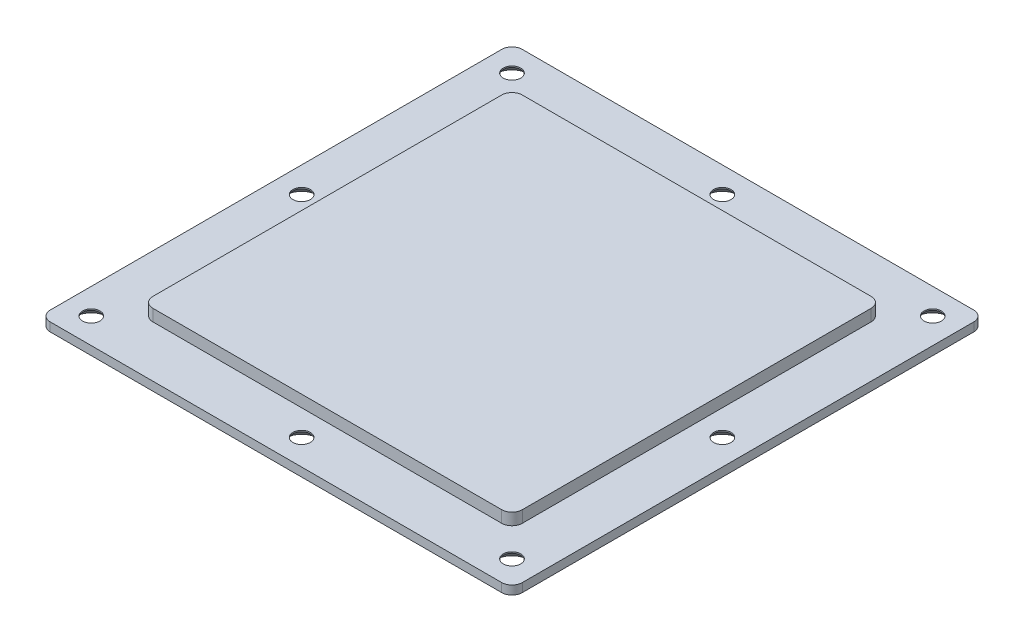
ISO-10303-21;
HEADER;
FILE_DESCRIPTION(('STEP AP214'),'2;1');
FILE_NAME('part.step','',(''),(''),'','','');
FILE_SCHEMA(('AUTOMOTIVE_DESIGN { 1 0 10303 214 1 1 1 1 }'));
ENDSEC;
DATA;
#1=APPLICATION_CONTEXT('core data for automotive mechanical design processes');
#2=APPLICATION_PROTOCOL_DEFINITION('international standard','automotive_design',2000,#1);
#3=PRODUCT_CONTEXT('',#1,'mechanical');
#4=PRODUCT('Part','Part','',(#3));
#5=PRODUCT_RELATED_PRODUCT_CATEGORY('part','',(#4));
#6=PRODUCT_DEFINITION_FORMATION('','',#4);
#7=PRODUCT_DEFINITION_CONTEXT('part definition',#1,'design');
#8=PRODUCT_DEFINITION('design','',#6,#7);
#9=PRODUCT_DEFINITION_SHAPE('','',#8);
#10=(LENGTH_UNIT() NAMED_UNIT(*) SI_UNIT(.MILLI.,.METRE.));
#11=(NAMED_UNIT(*) PLANE_ANGLE_UNIT() SI_UNIT($,.RADIAN.));
#12=(NAMED_UNIT(*) SI_UNIT($,.STERADIAN.) SOLID_ANGLE_UNIT());
#13=UNCERTAINTY_MEASURE_WITH_UNIT(LENGTH_MEASURE(1.E-05),#10,'distance_accuracy_value','');
#14=(GEOMETRIC_REPRESENTATION_CONTEXT(3) GLOBAL_UNCERTAINTY_ASSIGNED_CONTEXT((#13)) GLOBAL_UNIT_ASSIGNED_CONTEXT((#10,
#11,#12)) REPRESENTATION_CONTEXT('',''));
#15=CARTESIAN_POINT('',(0.,0.,0.));
#16=DIRECTION('',(0.,0.,1.));
#17=DIRECTION('',(1.,0.,0.));
#18=AXIS2_PLACEMENT_3D('',#15,#16,#17);
#19=CARTESIAN_POINT('',(0.,0.85,0.));
#20=DIRECTION('',(0.,-1.,0.));
#21=DIRECTION('',(0.,0.,-1.));
#22=AXIS2_PLACEMENT_3D('',#19,#20,#21);
#23=PLANE('',#22);
#24=CARTESIAN_POINT('',(-41.,0.85,41.));
#25=DIRECTION('',(0.,-1.,0.));
#26=DIRECTION('',(0.,0.,-1.));
#27=AXIS2_PLACEMENT_3D('',#24,#25,#26);
#28=CIRCLE('',#27,1.7);
#29=CARTESIAN_POINT('',(-41.,0.85,39.3));
#30=VERTEX_POINT('',#29);
#31=EDGE_CURVE('E225',#30,#30,#28,.T.);
#32=ORIENTED_EDGE('',*,*,#31,.T.);
#33=EDGE_LOOP('',(#32));
#34=FACE_BOUND('',#33,.T.);
#35=CARTESIAN_POINT('',(0.,0.85,41.));
#36=DIRECTION('',(0.,-1.,0.));
#37=DIRECTION('',(0.,0.,-1.));
#38=AXIS2_PLACEMENT_3D('',#35,#36,#37);
#39=CIRCLE('',#38,1.7);
#40=CARTESIAN_POINT('',(0.,0.85,39.3));
#41=VERTEX_POINT('',#40);
#42=EDGE_CURVE('E220',#41,#41,#39,.T.);
#43=ORIENTED_EDGE('',*,*,#42,.T.);
#44=EDGE_LOOP('',(#43));
#45=FACE_BOUND('',#44,.T.);
#46=CARTESIAN_POINT('',(41.,0.85,41.));
#47=DIRECTION('',(0.,-1.,0.));
#48=DIRECTION('',(0.,0.,-1.));
#49=AXIS2_PLACEMENT_3D('',#46,#47,#48);
#50=CIRCLE('',#49,1.7);
#51=CARTESIAN_POINT('',(41.,0.85,39.3));
#52=VERTEX_POINT('',#51);
#53=EDGE_CURVE('E215',#52,#52,#50,.T.);
#54=ORIENTED_EDGE('',*,*,#53,.T.);
#55=EDGE_LOOP('',(#54));
#56=FACE_BOUND('',#55,.T.);
#57=CARTESIAN_POINT('',(41.,0.85,0.));
#58=DIRECTION('',(0.,-1.,0.));
#59=DIRECTION('',(0.,0.,-1.));
#60=AXIS2_PLACEMENT_3D('',#57,#58,#59);
#61=CIRCLE('',#60,1.7);
#62=CARTESIAN_POINT('',(41.,0.85,-1.7));
#63=VERTEX_POINT('',#62);
#64=EDGE_CURVE('E210',#63,#63,#61,.T.);
#65=ORIENTED_EDGE('',*,*,#64,.T.);
#66=EDGE_LOOP('',(#65));
#67=FACE_BOUND('',#66,.T.);
#68=CARTESIAN_POINT('',(41.,0.85,-41.));
#69=DIRECTION('',(0.,-1.,0.));
#70=DIRECTION('',(0.,0.,-1.));
#71=AXIS2_PLACEMENT_3D('',#68,#69,#70);
#72=CIRCLE('',#71,1.7);
#73=CARTESIAN_POINT('',(41.,0.85,-42.7));
#74=VERTEX_POINT('',#73);
#75=EDGE_CURVE('E205',#74,#74,#72,.T.);
#76=ORIENTED_EDGE('',*,*,#75,.T.);
#77=EDGE_LOOP('',(#76));
#78=FACE_BOUND('',#77,.T.);
#79=CARTESIAN_POINT('',(0.,0.85,-41.));
#80=DIRECTION('',(0.,-1.,0.));
#81=DIRECTION('',(0.,0.,-1.));
#82=AXIS2_PLACEMENT_3D('',#79,#80,#81);
#83=CIRCLE('',#82,1.7);
#84=CARTESIAN_POINT('',(0.,0.85,-42.7));
#85=VERTEX_POINT('',#84);
#86=EDGE_CURVE('E200',#85,#85,#83,.T.);
#87=ORIENTED_EDGE('',*,*,#86,.T.);
#88=EDGE_LOOP('',(#87));
#89=FACE_BOUND('',#88,.T.);
#90=CARTESIAN_POINT('',(-41.,0.85,-41.));
#91=DIRECTION('',(0.,-1.,0.));
#92=DIRECTION('',(0.,0.,-1.));
#93=AXIS2_PLACEMENT_3D('',#90,#91,#92);
#94=CIRCLE('',#93,1.7);
#95=CARTESIAN_POINT('',(-41.,0.85,-42.7));
#96=VERTEX_POINT('',#95);
#97=EDGE_CURVE('E195',#96,#96,#94,.T.);
#98=ORIENTED_EDGE('',*,*,#97,.T.);
#99=EDGE_LOOP('',(#98));
#100=FACE_BOUND('',#99,.T.);
#101=CARTESIAN_POINT('',(-41.,0.85,0.));
#102=DIRECTION('',(0.,-1.,0.));
#103=DIRECTION('',(0.,0.,-1.));
#104=AXIS2_PLACEMENT_3D('',#101,#102,#103);
#105=CIRCLE('',#104,1.7);
#106=CARTESIAN_POINT('',(-41.,0.85,-1.7));
#107=VERTEX_POINT('',#106);
#108=EDGE_CURVE('E190',#107,#107,#105,.T.);
#109=ORIENTED_EDGE('',*,*,#108,.T.);
#110=EDGE_LOOP('',(#109));
#111=FACE_BOUND('',#110,.T.);
#112=DIRECTION('',(1.,0.,0.));
#113=VECTOR('',#112,1.);
#114=CARTESIAN_POINT('',(-46.,0.85,46.));
#115=LINE('',#114,#113);
#116=CARTESIAN_POINT('',(-44.,0.85,46.));
#117=VERTEX_POINT('',#116);
#118=CARTESIAN_POINT('',(44.,0.85,46.));
#119=VERTEX_POINT('',#118);
#120=EDGE_CURVE('E183',#117,#119,#115,.T.);
#121=ORIENTED_EDGE('',*,*,#120,.T.);
#122=CARTESIAN_POINT('',(44.,0.85,44.));
#123=DIRECTION('',(0.,-1.,0.));
#124=DIRECTION('',(0.,0.,-1.));
#125=AXIS2_PLACEMENT_3D('',#122,#123,#124);
#126=CIRCLE('',#125,2.);
#127=CARTESIAN_POINT('',(46.,0.85,44.));
#128=VERTEX_POINT('',#127);
#129=EDGE_CURVE('E243',#119,#128,#126,.F.);
#130=ORIENTED_EDGE('',*,*,#129,.T.);
#131=DIRECTION('',(0.,0.,-1.));
#132=VECTOR('',#131,1.);
#133=CARTESIAN_POINT('',(46.,0.85,46.));
#134=LINE('',#133,#132);
#135=CARTESIAN_POINT('',(46.,0.85,-44.));
#136=VERTEX_POINT('',#135);
#137=EDGE_CURVE('E167',#128,#136,#134,.T.);
#138=ORIENTED_EDGE('',*,*,#137,.T.);
#139=CARTESIAN_POINT('',(44.,0.85,-44.));
#140=DIRECTION('',(0.,-1.,0.));
#141=DIRECTION('',(0.,0.,-1.));
#142=AXIS2_PLACEMENT_3D('',#139,#140,#141);
#143=CIRCLE('',#142,2.);
#144=CARTESIAN_POINT('',(44.,0.85,-46.));
#145=VERTEX_POINT('',#144);
#146=EDGE_CURVE('E239',#136,#145,#143,.F.);
#147=ORIENTED_EDGE('',*,*,#146,.T.);
#148=DIRECTION('',(-1.,0.,0.));
#149=VECTOR('',#148,1.);
#150=CARTESIAN_POINT('',(-46.,0.85,-46.));
#151=LINE('',#150,#149);
#152=CARTESIAN_POINT('',(-44.,0.85,-46.));
#153=VERTEX_POINT('',#152);
#154=EDGE_CURVE('E320',#145,#153,#151,.T.);
#155=ORIENTED_EDGE('',*,*,#154,.T.);
#156=CARTESIAN_POINT('',(-44.,0.85,-44.));
#157=DIRECTION('',(0.,-1.,0.));
#158=DIRECTION('',(0.,0.,-1.));
#159=AXIS2_PLACEMENT_3D('',#156,#157,#158);
#160=CIRCLE('',#159,2.);
#161=CARTESIAN_POINT('',(-46.,0.85,-44.));
#162=VERTEX_POINT('',#161);
#163=EDGE_CURVE('E241',#153,#162,#160,.F.);
#164=ORIENTED_EDGE('',*,*,#163,.T.);
#165=DIRECTION('',(0.,0.,1.));
#166=VECTOR('',#165,1.);
#167=CARTESIAN_POINT('',(-46.,0.85,46.));
#168=LINE('',#167,#166);
#169=CARTESIAN_POINT('',(-46.,0.85,44.));
#170=VERTEX_POINT('',#169);
#171=EDGE_CURVE('E322',#162,#170,#168,.T.);
#172=ORIENTED_EDGE('',*,*,#171,.T.);
#173=CARTESIAN_POINT('',(-44.,0.85,44.));
#174=DIRECTION('',(0.,-1.,0.));
#175=DIRECTION('',(0.,0.,-1.));
#176=AXIS2_PLACEMENT_3D('',#173,#174,#175);
#177=CIRCLE('',#176,2.);
#178=EDGE_CURVE('E237',#170,#117,#177,.F.);
#179=ORIENTED_EDGE('',*,*,#178,.T.);
#180=EDGE_LOOP('',(#121,#130,#138,#147,#155,#164,#172,#179));
#181=FACE_BOUND('',#180,.T.);
#182=DIRECTION('',(0.,0.,-1.));
#183=VECTOR('',#182,1.);
#184=CARTESIAN_POINT('',(36.,0.85,36.));
#185=LINE('',#184,#183);
#186=CARTESIAN_POINT('',(36.,0.85,34.));
#187=VERTEX_POINT('',#186);
#188=CARTESIAN_POINT('',(36.,0.85,-34.));
#189=VERTEX_POINT('',#188);
#190=EDGE_CURVE('E193',#187,#189,#185,.T.);
#191=ORIENTED_EDGE('',*,*,#190,.F.);
#192=CARTESIAN_POINT('',(34.,0.85,34.));
#193=DIRECTION('',(0.,-1.,0.));
#194=DIRECTION('',(0.,0.,-1.));
#195=AXIS2_PLACEMENT_3D('',#192,#193,#194);
#196=CIRCLE('',#195,2.);
#197=CARTESIAN_POINT('',(34.,0.85,36.));
#198=VERTEX_POINT('',#197);
#199=EDGE_CURVE('E41',#187,#198,#196,.T.);
#200=ORIENTED_EDGE('',*,*,#199,.T.);
#201=DIRECTION('',(1.,0.,0.));
#202=VECTOR('',#201,1.);
#203=CARTESIAN_POINT('',(-36.,0.85,36.));
#204=LINE('',#203,#202);
#205=CARTESIAN_POINT('',(-34.,0.85,36.));
#206=VERTEX_POINT('',#205);
#207=EDGE_CURVE('E287',#206,#198,#204,.T.);
#208=ORIENTED_EDGE('',*,*,#207,.F.);
#209=CARTESIAN_POINT('',(-34.,0.85,34.));
#210=DIRECTION('',(0.,-1.,0.));
#211=DIRECTION('',(0.,0.,-1.));
#212=AXIS2_PLACEMENT_3D('',#209,#210,#211);
#213=CIRCLE('',#212,2.);
#214=CARTESIAN_POINT('',(-36.,0.85,34.));
#215=VERTEX_POINT('',#214);
#216=EDGE_CURVE('E11',#206,#215,#213,.T.);
#217=ORIENTED_EDGE('',*,*,#216,.T.);
#218=DIRECTION('',(0.,0.,1.));
#219=VECTOR('',#218,1.);
#220=CARTESIAN_POINT('',(-36.,0.85,36.));
#221=LINE('',#220,#219);
#222=CARTESIAN_POINT('',(-36.,0.85,-34.));
#223=VERTEX_POINT('',#222);
#224=EDGE_CURVE('E294',#223,#215,#221,.T.);
#225=ORIENTED_EDGE('',*,*,#224,.F.);
#226=CARTESIAN_POINT('',(-34.,0.85,-34.));
#227=DIRECTION('',(0.,-1.,0.));
#228=DIRECTION('',(0.,0.,-1.));
#229=AXIS2_PLACEMENT_3D('',#226,#227,#228);
#230=CIRCLE('',#229,2.);
#231=CARTESIAN_POINT('',(-34.,0.85,-36.));
#232=VERTEX_POINT('',#231);
#233=EDGE_CURVE('E283',#223,#232,#230,.T.);
#234=ORIENTED_EDGE('',*,*,#233,.T.);
#235=DIRECTION('',(-1.,0.,0.));
#236=VECTOR('',#235,1.);
#237=CARTESIAN_POINT('',(-36.,0.85,-36.));
#238=LINE('',#237,#236);
#239=CARTESIAN_POINT('',(34.,0.85,-36.));
#240=VERTEX_POINT('',#239);
#241=EDGE_CURVE('E314',#240,#232,#238,.T.);
#242=ORIENTED_EDGE('',*,*,#241,.F.);
#243=CARTESIAN_POINT('',(34.,0.85,-34.));
#244=DIRECTION('',(0.,-1.,0.));
#245=DIRECTION('',(0.,0.,-1.));
#246=AXIS2_PLACEMENT_3D('',#243,#244,#245);
#247=CIRCLE('',#246,2.);
#248=EDGE_CURVE('E281',#240,#189,#247,.T.);
#249=ORIENTED_EDGE('',*,*,#248,.T.);
#250=EDGE_LOOP('',(#191,#200,#208,#217,#225,#234,#242,#249));
#251=FACE_BOUND('',#250,.T.);
#252=ADVANCED_FACE('F33',(#34,#45,#56,#67,#78,#89,#100,#111,#181,#251),#23,.F.);
#253=CARTESIAN_POINT('',(46.,0.85,46.));
#254=DIRECTION('',(-1.,0.,0.));
#255=DIRECTION('',(0.,0.,1.));
#256=AXIS2_PLACEMENT_3D('',#253,#254,#255);
#257=PLANE('',#256);
#258=ORIENTED_EDGE('',*,*,#137,.F.);
#259=DIRECTION('',(0.,-1.,0.));
#260=VECTOR('',#259,1.);
#261=CARTESIAN_POINT('',(46.,0.85,44.));
#262=LINE('',#261,#260);
#263=CARTESIAN_POINT('',(46.,-0.85,44.));
#264=VERTEX_POINT('',#263);
#265=EDGE_CURVE('E151',#128,#264,#262,.T.);
#266=ORIENTED_EDGE('',*,*,#265,.T.);
#267=DIRECTION('',(0.,0.,-1.));
#268=VECTOR('',#267,1.);
#269=CARTESIAN_POINT('',(46.,-0.85,46.));
#270=LINE('',#269,#268);
#271=CARTESIAN_POINT('',(46.,-0.85,-44.));
#272=VERTEX_POINT('',#271);
#273=EDGE_CURVE('E164',#264,#272,#270,.T.);
#274=ORIENTED_EDGE('',*,*,#273,.T.);
#275=DIRECTION('',(0.,-1.,0.));
#276=VECTOR('',#275,1.);
#277=CARTESIAN_POINT('',(46.,0.85,-44.));
#278=LINE('',#277,#276);
#279=EDGE_CURVE('E169',#272,#136,#278,.F.);
#280=ORIENTED_EDGE('',*,*,#279,.T.);
#281=EDGE_LOOP('',(#258,#266,#274,#280));
#282=FACE_BOUND('',#281,.T.);
#283=ADVANCED_FACE('F163',(#282),#257,.F.);
#284=CARTESIAN_POINT('',(-46.,0.85,-46.));
#285=DIRECTION('',(0.,0.,1.));
#286=DIRECTION('',(1.,0.,0.));
#287=AXIS2_PLACEMENT_3D('',#284,#285,#286);
#288=PLANE('',#287);
#289=DIRECTION('',(-1.,0.,0.));
#290=VECTOR('',#289,1.);
#291=CARTESIAN_POINT('',(-46.,-0.85,-46.));
#292=LINE('',#291,#290);
#293=CARTESIAN_POINT('',(44.,-0.85,-46.));
#294=VERTEX_POINT('',#293);
#295=CARTESIAN_POINT('',(-44.,-0.85,-46.));
#296=VERTEX_POINT('',#295);
#297=EDGE_CURVE('E174',#294,#296,#292,.T.);
#298=ORIENTED_EDGE('',*,*,#297,.T.);
#299=DIRECTION('',(0.,-1.,0.));
#300=VECTOR('',#299,1.);
#301=CARTESIAN_POINT('',(-44.,0.85,-46.));
#302=LINE('',#301,#300);
#303=EDGE_CURVE('E253',#296,#153,#302,.F.);
#304=ORIENTED_EDGE('',*,*,#303,.T.);
#305=ORIENTED_EDGE('',*,*,#154,.F.);
#306=DIRECTION('',(0.,-1.,0.));
#307=VECTOR('',#306,1.);
#308=CARTESIAN_POINT('',(44.,0.85,-46.));
#309=LINE('',#308,#307);
#310=EDGE_CURVE('E250',#145,#294,#309,.T.);
#311=ORIENTED_EDGE('',*,*,#310,.T.);
#312=EDGE_LOOP('',(#298,#304,#305,#311));
#313=FACE_BOUND('',#312,.T.);
#314=ADVANCED_FACE('F344',(#313),#288,.F.);
#315=CARTESIAN_POINT('',(-46.,0.85,46.));
#316=DIRECTION('',(1.,0.,0.));
#317=DIRECTION('',(0.,0.,-1.));
#318=AXIS2_PLACEMENT_3D('',#315,#316,#317);
#319=PLANE('',#318);
#320=ORIENTED_EDGE('',*,*,#171,.F.);
#321=DIRECTION('',(0.,-1.,0.));
#322=VECTOR('',#321,1.);
#323=CARTESIAN_POINT('',(-46.,0.85,-44.));
#324=LINE('',#323,#322);
#325=CARTESIAN_POINT('',(-46.,-0.85,-44.));
#326=VERTEX_POINT('',#325);
#327=EDGE_CURVE('E247',#162,#326,#324,.T.);
#328=ORIENTED_EDGE('',*,*,#327,.T.);
#329=DIRECTION('',(0.,0.,1.));
#330=VECTOR('',#329,1.);
#331=CARTESIAN_POINT('',(-46.,-0.85,46.));
#332=LINE('',#331,#330);
#333=CARTESIAN_POINT('',(-46.,-0.85,44.));
#334=VERTEX_POINT('',#333);
#335=EDGE_CURVE('E178',#326,#334,#332,.T.);
#336=ORIENTED_EDGE('',*,*,#335,.T.);
#337=DIRECTION('',(0.,-1.,0.));
#338=VECTOR('',#337,1.);
#339=CARTESIAN_POINT('',(-46.,0.85,44.));
#340=LINE('',#339,#338);
#341=EDGE_CURVE('E245',#334,#170,#340,.F.);
#342=ORIENTED_EDGE('',*,*,#341,.T.);
#343=EDGE_LOOP('',(#320,#328,#336,#342));
#344=FACE_BOUND('',#343,.T.);
#345=ADVANCED_FACE('F337',(#344),#319,.F.);
#346=CARTESIAN_POINT('',(-46.,0.85,46.));
#347=DIRECTION('',(0.,0.,-1.));
#348=DIRECTION('',(-1.,0.,0.));
#349=AXIS2_PLACEMENT_3D('',#346,#347,#348);
#350=PLANE('',#349);
#351=DIRECTION('',(1.,0.,0.));
#352=VECTOR('',#351,1.);
#353=CARTESIAN_POINT('',(-46.,-0.85,46.));
#354=LINE('',#353,#352);
#355=CARTESIAN_POINT('',(-44.,-0.85,46.));
#356=VERTEX_POINT('',#355);
#357=CARTESIAN_POINT('',(44.,-0.85,46.));
#358=VERTEX_POINT('',#357);
#359=EDGE_CURVE('E188',#356,#358,#354,.T.);
#360=ORIENTED_EDGE('',*,*,#359,.T.);
#361=DIRECTION('',(0.,-1.,0.));
#362=VECTOR('',#361,1.);
#363=CARTESIAN_POINT('',(44.,0.85,46.));
#364=LINE('',#363,#362);
#365=EDGE_CURVE('E152',#358,#119,#364,.F.);
#366=ORIENTED_EDGE('',*,*,#365,.T.);
#367=ORIENTED_EDGE('',*,*,#120,.F.);
#368=DIRECTION('',(0.,-1.,0.));
#369=VECTOR('',#368,1.);
#370=CARTESIAN_POINT('',(-44.,0.85,46.));
#371=LINE('',#370,#369);
#372=EDGE_CURVE('E157',#117,#356,#371,.T.);
#373=ORIENTED_EDGE('',*,*,#372,.T.);
#374=EDGE_LOOP('',(#360,#366,#367,#373));
#375=FACE_BOUND('',#374,.T.);
#376=ADVANCED_FACE('F331',(#375),#350,.F.);
#377=CARTESIAN_POINT('',(0.,-0.85,0.));
#378=DIRECTION('',(0.,-1.,0.));
#379=DIRECTION('',(0.,0.,-1.));
#380=AXIS2_PLACEMENT_3D('',#377,#378,#379);
#381=PLANE('',#380);
#382=CARTESIAN_POINT('',(-41.,-0.850000000000002,41.));
#383=DIRECTION('',(0.,-1.,0.));
#384=DIRECTION('',(0.,0.,-1.));
#385=AXIS2_PLACEMENT_3D('',#382,#383,#384);
#386=CIRCLE('',#385,3.15);
#387=CARTESIAN_POINT('',(-41.,-0.850000000000002,37.85));
#388=VERTEX_POINT('',#387);
#389=EDGE_CURVE('E718',#388,#388,#386,.T.);
#390=ORIENTED_EDGE('',*,*,#389,.F.);
#391=EDGE_LOOP('',(#390));
#392=FACE_BOUND('',#391,.T.);
#393=CARTESIAN_POINT('',(0.,-0.850000000000002,41.));
#394=DIRECTION('',(0.,-1.,0.));
#395=DIRECTION('',(0.,0.,-1.));
#396=AXIS2_PLACEMENT_3D('',#393,#394,#395);
#397=CIRCLE('',#396,3.15);
#398=CARTESIAN_POINT('',(0.,-0.850000000000002,37.85));
#399=VERTEX_POINT('',#398);
#400=EDGE_CURVE('E228',#399,#399,#397,.T.);
#401=ORIENTED_EDGE('',*,*,#400,.F.);
#402=EDGE_LOOP('',(#401));
#403=FACE_BOUND('',#402,.T.);
#404=CARTESIAN_POINT('',(41.,-0.850000000000002,41.));
#405=DIRECTION('',(0.,-1.,0.));
#406=DIRECTION('',(0.,0.,-1.));
#407=AXIS2_PLACEMENT_3D('',#404,#405,#406);
#408=CIRCLE('',#407,3.15);
#409=CARTESIAN_POINT('',(41.,-0.850000000000002,37.85));
#410=VERTEX_POINT('',#409);
#411=EDGE_CURVE('E223',#410,#410,#408,.T.);
#412=ORIENTED_EDGE('',*,*,#411,.F.);
#413=EDGE_LOOP('',(#412));
#414=FACE_BOUND('',#413,.T.);
#415=CARTESIAN_POINT('',(41.,-0.850000000000002,0.));
#416=DIRECTION('',(0.,-1.,0.));
#417=DIRECTION('',(0.,0.,-1.));
#418=AXIS2_PLACEMENT_3D('',#415,#416,#417);
#419=CIRCLE('',#418,3.15);
#420=CARTESIAN_POINT('',(41.,-0.850000000000002,-3.15));
#421=VERTEX_POINT('',#420);
#422=EDGE_CURVE('E218',#421,#421,#419,.T.);
#423=ORIENTED_EDGE('',*,*,#422,.F.);
#424=EDGE_LOOP('',(#423));
#425=FACE_BOUND('',#424,.T.);
#426=CARTESIAN_POINT('',(41.,-0.850000000000002,-41.));
#427=DIRECTION('',(0.,-1.,0.));
#428=DIRECTION('',(0.,0.,-1.));
#429=AXIS2_PLACEMENT_3D('',#426,#427,#428);
#430=CIRCLE('',#429,3.15);
#431=CARTESIAN_POINT('',(41.,-0.850000000000002,-44.15));
#432=VERTEX_POINT('',#431);
#433=EDGE_CURVE('E213',#432,#432,#430,.T.);
#434=ORIENTED_EDGE('',*,*,#433,.F.);
#435=EDGE_LOOP('',(#434));
#436=FACE_BOUND('',#435,.T.);
#437=CARTESIAN_POINT('',(0.,-0.850000000000002,-41.));
#438=DIRECTION('',(0.,-1.,0.));
#439=DIRECTION('',(0.,0.,-1.));
#440=AXIS2_PLACEMENT_3D('',#437,#438,#439);
#441=CIRCLE('',#440,3.15);
#442=CARTESIAN_POINT('',(0.,-0.850000000000002,-44.15));
#443=VERTEX_POINT('',#442);
#444=EDGE_CURVE('E208',#443,#443,#441,.T.);
#445=ORIENTED_EDGE('',*,*,#444,.F.);
#446=EDGE_LOOP('',(#445));
#447=FACE_BOUND('',#446,.T.);
#448=CARTESIAN_POINT('',(-41.,-0.850000000000002,-41.));
#449=DIRECTION('',(0.,-1.,0.));
#450=DIRECTION('',(0.,0.,-1.));
#451=AXIS2_PLACEMENT_3D('',#448,#449,#450);
#452=CIRCLE('',#451,3.15);
#453=CARTESIAN_POINT('',(-41.,-0.850000000000002,-44.15));
#454=VERTEX_POINT('',#453);
#455=EDGE_CURVE('E203',#454,#454,#452,.T.);
#456=ORIENTED_EDGE('',*,*,#455,.F.);
#457=EDGE_LOOP('',(#456));
#458=FACE_BOUND('',#457,.T.);
#459=CARTESIAN_POINT('',(-41.,-0.850000000000002,0.));
#460=DIRECTION('',(0.,-1.,0.));
#461=DIRECTION('',(0.,0.,-1.));
#462=AXIS2_PLACEMENT_3D('',#459,#460,#461);
#463=CIRCLE('',#462,3.15);
#464=CARTESIAN_POINT('',(-41.,-0.850000000000002,-3.15));
#465=VERTEX_POINT('',#464);
#466=EDGE_CURVE('E198',#465,#465,#463,.T.);
#467=ORIENTED_EDGE('',*,*,#466,.F.);
#468=EDGE_LOOP('',(#467));
#469=FACE_BOUND('',#468,.T.);
#470=ORIENTED_EDGE('',*,*,#273,.F.);
#471=CARTESIAN_POINT('',(44.,-0.85,44.));
#472=DIRECTION('',(0.,-1.,0.));
#473=DIRECTION('',(0.,0.,-1.));
#474=AXIS2_PLACEMENT_3D('',#471,#472,#473);
#475=CIRCLE('',#474,2.);
#476=EDGE_CURVE('E147',#264,#358,#475,.T.);
#477=ORIENTED_EDGE('',*,*,#476,.T.);
#478=ORIENTED_EDGE('',*,*,#359,.F.);
#479=CARTESIAN_POINT('',(-44.,-0.85,44.));
#480=DIRECTION('',(0.,-1.,0.));
#481=DIRECTION('',(0.,0.,-1.));
#482=AXIS2_PLACEMENT_3D('',#479,#480,#481);
#483=CIRCLE('',#482,2.);
#484=EDGE_CURVE('E168',#356,#334,#483,.T.);
#485=ORIENTED_EDGE('',*,*,#484,.T.);
#486=ORIENTED_EDGE('',*,*,#335,.F.);
#487=CARTESIAN_POINT('',(-44.,-0.85,-44.));
#488=DIRECTION('',(0.,-1.,0.));
#489=DIRECTION('',(0.,0.,-1.));
#490=AXIS2_PLACEMENT_3D('',#487,#488,#489);
#491=CIRCLE('',#490,2.);
#492=EDGE_CURVE('E158',#326,#296,#491,.T.);
#493=ORIENTED_EDGE('',*,*,#492,.T.);
#494=ORIENTED_EDGE('',*,*,#297,.F.);
#495=CARTESIAN_POINT('',(44.,-0.85,-44.));
#496=DIRECTION('',(0.,-1.,0.));
#497=DIRECTION('',(0.,0.,-1.));
#498=AXIS2_PLACEMENT_3D('',#495,#496,#497);
#499=CIRCLE('',#498,2.);
#500=EDGE_CURVE('E173',#294,#272,#499,.T.);
#501=ORIENTED_EDGE('',*,*,#500,.T.);
#502=EDGE_LOOP('',(#470,#477,#478,#485,#486,#493,#494,#501));
#503=FACE_BOUND('',#502,.T.);
#504=ADVANCED_FACE('F171',(#392,#403,#414,#425,#436,#447,#458,#469,#503),#381,.T.);
#505=CARTESIAN_POINT('',(36.,3.15,36.));
#506=DIRECTION('',(-1.,0.,0.));
#507=DIRECTION('',(0.,0.,1.));
#508=AXIS2_PLACEMENT_3D('',#505,#506,#507);
#509=PLANE('',#508);
#510=ORIENTED_EDGE('',*,*,#190,.T.);
#511=DIRECTION('',(0.,-1.,0.));
#512=VECTOR('',#511,1.);
#513=CARTESIAN_POINT('',(36.,3.15,-34.));
#514=LINE('',#513,#512);
#515=CARTESIAN_POINT('',(36.,3.15,-34.));
#516=VERTEX_POINT('',#515);
#517=EDGE_CURVE('E263',#189,#516,#514,.F.);
#518=ORIENTED_EDGE('',*,*,#517,.T.);
#519=DIRECTION('',(0.,0.,-1.));
#520=VECTOR('',#519,1.);
#521=CARTESIAN_POINT('',(36.,3.15,36.));
#522=LINE('',#521,#520);
#523=CARTESIAN_POINT('',(36.,3.15,34.));
#524=VERTEX_POINT('',#523);
#525=EDGE_CURVE('E293',#524,#516,#522,.T.);
#526=ORIENTED_EDGE('',*,*,#525,.F.);
#527=DIRECTION('',(0.,-1.,0.));
#528=VECTOR('',#527,1.);
#529=CARTESIAN_POINT('',(36.,3.15,34.));
#530=LINE('',#529,#528);
#531=EDGE_CURVE('E260',#524,#187,#530,.T.);
#532=ORIENTED_EDGE('',*,*,#531,.T.);
#533=EDGE_LOOP('',(#510,#518,#526,#532));
#534=FACE_BOUND('',#533,.T.);
#535=ADVANCED_FACE('F303',(#534),#509,.F.);
#536=CARTESIAN_POINT('',(-36.,3.15,-36.));
#537=DIRECTION('',(0.,0.,1.));
#538=DIRECTION('',(1.,0.,0.));
#539=AXIS2_PLACEMENT_3D('',#536,#537,#538);
#540=PLANE('',#539);
#541=DIRECTION('',(-1.,0.,0.));
#542=VECTOR('',#541,1.);
#543=CARTESIAN_POINT('',(-36.,3.15,-36.));
#544=LINE('',#543,#542);
#545=CARTESIAN_POINT('',(34.,3.15,-36.));
#546=VERTEX_POINT('',#545);
#547=CARTESIAN_POINT('',(-34.,3.15,-36.));
#548=VERTEX_POINT('',#547);
#549=EDGE_CURVE('E305',#546,#548,#544,.T.);
#550=ORIENTED_EDGE('',*,*,#549,.F.);
#551=DIRECTION('',(0.,-1.,0.));
#552=VECTOR('',#551,1.);
#553=CARTESIAN_POINT('',(34.,3.15,-36.));
#554=LINE('',#553,#552);
#555=EDGE_CURVE('E257',#546,#240,#554,.T.);
#556=ORIENTED_EDGE('',*,*,#555,.T.);
#557=ORIENTED_EDGE('',*,*,#241,.T.);
#558=DIRECTION('',(0.,-1.,0.));
#559=VECTOR('',#558,1.);
#560=CARTESIAN_POINT('',(-34.,3.15,-36.));
#561=LINE('',#560,#559);
#562=EDGE_CURVE('E255',#232,#548,#561,.F.);
#563=ORIENTED_EDGE('',*,*,#562,.T.);
#564=EDGE_LOOP('',(#550,#556,#557,#563));
#565=FACE_BOUND('',#564,.T.);
#566=ADVANCED_FACE('F457',(#565),#540,.F.);
#567=CARTESIAN_POINT('',(-36.,3.15,36.));
#568=DIRECTION('',(1.,0.,0.));
#569=DIRECTION('',(0.,0.,-1.));
#570=AXIS2_PLACEMENT_3D('',#567,#568,#569);
#571=PLANE('',#570);
#572=DIRECTION('',(0.,0.,1.));
#573=VECTOR('',#572,1.);
#574=CARTESIAN_POINT('',(-36.,3.15,36.));
#575=LINE('',#574,#573);
#576=CARTESIAN_POINT('',(-36.,3.15,-34.));
#577=VERTEX_POINT('',#576);
#578=CARTESIAN_POINT('',(-36.,3.15,34.));
#579=VERTEX_POINT('',#578);
#580=EDGE_CURVE('E180',#577,#579,#575,.T.);
#581=ORIENTED_EDGE('',*,*,#580,.F.);
#582=DIRECTION('',(0.,-1.,0.));
#583=VECTOR('',#582,1.);
#584=CARTESIAN_POINT('',(-36.,3.15,-34.));
#585=LINE('',#584,#583);
#586=EDGE_CURVE('E274',#577,#223,#585,.T.);
#587=ORIENTED_EDGE('',*,*,#586,.T.);
#588=ORIENTED_EDGE('',*,*,#224,.T.);
#589=DIRECTION('',(0.,-1.,0.));
#590=VECTOR('',#589,1.);
#591=CARTESIAN_POINT('',(-36.,3.15,34.));
#592=LINE('',#591,#590);
#593=EDGE_CURVE('E272',#215,#579,#592,.F.);
#594=ORIENTED_EDGE('',*,*,#593,.T.);
#595=EDGE_LOOP('',(#581,#587,#588,#594));
#596=FACE_BOUND('',#595,.T.);
#597=ADVANCED_FACE('F455',(#596),#571,.F.);
#598=CARTESIAN_POINT('',(-36.,3.15,36.));
#599=DIRECTION('',(0.,0.,-1.));
#600=DIRECTION('',(-1.,0.,0.));
#601=AXIS2_PLACEMENT_3D('',#598,#599,#600);
#602=PLANE('',#601);
#603=ORIENTED_EDGE('',*,*,#207,.T.);
#604=DIRECTION('',(0.,-1.,0.));
#605=VECTOR('',#604,1.);
#606=CARTESIAN_POINT('',(34.,3.15,36.));
#607=LINE('',#606,#605);
#608=CARTESIAN_POINT('',(34.,3.15,36.));
#609=VERTEX_POINT('',#608);
#610=EDGE_CURVE('E48',#198,#609,#607,.F.);
#611=ORIENTED_EDGE('',*,*,#610,.T.);
#612=DIRECTION('',(1.,0.,0.));
#613=VECTOR('',#612,1.);
#614=CARTESIAN_POINT('',(-36.,3.15,36.));
#615=LINE('',#614,#613);
#616=CARTESIAN_POINT('',(-34.,3.15,36.));
#617=VERTEX_POINT('',#616);
#618=EDGE_CURVE('E175',#617,#609,#615,.T.);
#619=ORIENTED_EDGE('',*,*,#618,.F.);
#620=DIRECTION('',(0.,-1.,0.));
#621=VECTOR('',#620,1.);
#622=CARTESIAN_POINT('',(-34.,3.15,36.));
#623=LINE('',#622,#621);
#624=EDGE_CURVE('E277',#617,#206,#623,.T.);
#625=ORIENTED_EDGE('',*,*,#624,.T.);
#626=EDGE_LOOP('',(#603,#611,#619,#625));
#627=FACE_BOUND('',#626,.T.);
#628=ADVANCED_FACE('F291',(#627),#602,.F.);
#629=CARTESIAN_POINT('',(0.,3.15,0.));
#630=DIRECTION('',(0.,-1.,0.));
#631=DIRECTION('',(0.,0.,-1.));
#632=AXIS2_PLACEMENT_3D('',#629,#630,#631);
#633=PLANE('',#632);
#634=ORIENTED_EDGE('',*,*,#525,.T.);
#635=CARTESIAN_POINT('',(34.,3.15,-34.));
#636=DIRECTION('',(0.,-1.,0.));
#637=DIRECTION('',(0.,0.,-1.));
#638=AXIS2_PLACEMENT_3D('',#635,#636,#637);
#639=CIRCLE('',#638,2.);
#640=EDGE_CURVE('E270',#516,#546,#639,.F.);
#641=ORIENTED_EDGE('',*,*,#640,.T.);
#642=ORIENTED_EDGE('',*,*,#549,.T.);
#643=CARTESIAN_POINT('',(-34.,3.15,-34.));
#644=DIRECTION('',(0.,-1.,0.));
#645=DIRECTION('',(0.,0.,-1.));
#646=AXIS2_PLACEMENT_3D('',#643,#644,#645);
#647=CIRCLE('',#646,2.);
#648=EDGE_CURVE('E268',#548,#577,#647,.F.);
#649=ORIENTED_EDGE('',*,*,#648,.T.);
#650=ORIENTED_EDGE('',*,*,#580,.T.);
#651=CARTESIAN_POINT('',(-34.,3.15,34.));
#652=DIRECTION('',(0.,-1.,0.));
#653=DIRECTION('',(0.,0.,-1.));
#654=AXIS2_PLACEMENT_3D('',#651,#652,#653);
#655=CIRCLE('',#654,2.);
#656=EDGE_CURVE('E55',#579,#617,#655,.F.);
#657=ORIENTED_EDGE('',*,*,#656,.T.);
#658=ORIENTED_EDGE('',*,*,#618,.T.);
#659=CARTESIAN_POINT('',(34.,3.15,34.));
#660=DIRECTION('',(0.,-1.,0.));
#661=DIRECTION('',(0.,0.,-1.));
#662=AXIS2_PLACEMENT_3D('',#659,#660,#661);
#663=CIRCLE('',#662,2.);
#664=EDGE_CURVE('E266',#609,#524,#663,.F.);
#665=ORIENTED_EDGE('',*,*,#664,.T.);
#666=EDGE_LOOP('',(#634,#641,#642,#649,#650,#657,#658,#665));
#667=FACE_BOUND('',#666,.T.);
#668=ADVANCED_FACE('F300',(#667),#633,.F.);
#669=CARTESIAN_POINT('',(-41.,-0.85,0.));
#670=DIRECTION('',(0.,-1.,0.));
#671=DIRECTION('',(0.,0.,-1.));
#672=AXIS2_PLACEMENT_3D('',#669,#670,#671);
#673=CYLINDRICAL_SURFACE('',#672,1.7);
#674=CARTESIAN_POINT('',(-41.,0.6,0.));
#675=DIRECTION('',(0.,-1.,0.));
#676=DIRECTION('',(0.,0.,-1.));
#677=AXIS2_PLACEMENT_3D('',#674,#675,#676);
#678=CIRCLE('',#677,1.7);
#679=CARTESIAN_POINT('',(-41.,0.6,-1.7));
#680=VERTEX_POINT('',#679);
#681=EDGE_CURVE('E194',#680,#680,#678,.T.);
#682=ORIENTED_EDGE('',*,*,#681,.T.);
#683=EDGE_LOOP('',(#682));
#684=FACE_BOUND('',#683,.T.);
#685=ORIENTED_EDGE('',*,*,#108,.F.);
#686=EDGE_LOOP('',(#685));
#687=FACE_BOUND('',#686,.T.);
#688=ADVANCED_FACE('F446',(#684,#687),#673,.F.);
#689=CARTESIAN_POINT('',(-41.,-0.850000000000002,0.));
#690=DIRECTION('',(0.,-1.,0.));
#691=DIRECTION('',(0.,0.,-1.));
#692=AXIS2_PLACEMENT_3D('',#689,#690,#691);
#693=CONICAL_SURFACE('',#692,3.15,0.785398163397448);
#694=ORIENTED_EDGE('',*,*,#681,.F.);
#695=EDGE_LOOP('',(#694));
#696=FACE_BOUND('',#695,.T.);
#697=ORIENTED_EDGE('',*,*,#466,.T.);
#698=EDGE_LOOP('',(#697));
#699=FACE_BOUND('',#698,.T.);
#700=ADVANCED_FACE('F442',(#696,#699),#693,.F.);
#701=CARTESIAN_POINT('',(-41.,-0.85,-41.));
#702=DIRECTION('',(0.,-1.,0.));
#703=DIRECTION('',(0.,0.,-1.));
#704=AXIS2_PLACEMENT_3D('',#701,#702,#703);
#705=CYLINDRICAL_SURFACE('',#704,1.7);
#706=CARTESIAN_POINT('',(-41.,0.6,-41.));
#707=DIRECTION('',(0.,-1.,0.));
#708=DIRECTION('',(0.,0.,-1.));
#709=AXIS2_PLACEMENT_3D('',#706,#707,#708);
#710=CIRCLE('',#709,1.7);
#711=CARTESIAN_POINT('',(-41.,0.6,-42.7));
#712=VERTEX_POINT('',#711);
#713=EDGE_CURVE('E199',#712,#712,#710,.T.);
#714=ORIENTED_EDGE('',*,*,#713,.T.);
#715=EDGE_LOOP('',(#714));
#716=FACE_BOUND('',#715,.T.);
#717=ORIENTED_EDGE('',*,*,#97,.F.);
#718=EDGE_LOOP('',(#717));
#719=FACE_BOUND('',#718,.T.);
#720=ADVANCED_FACE('F438',(#716,#719),#705,.F.);
#721=CARTESIAN_POINT('',(-41.,-0.850000000000002,-41.));
#722=DIRECTION('',(0.,-1.,0.));
#723=DIRECTION('',(0.,0.,-1.));
#724=AXIS2_PLACEMENT_3D('',#721,#722,#723);
#725=CONICAL_SURFACE('',#724,3.15,0.785398163397448);
#726=ORIENTED_EDGE('',*,*,#713,.F.);
#727=EDGE_LOOP('',(#726));
#728=FACE_BOUND('',#727,.T.);
#729=ORIENTED_EDGE('',*,*,#455,.T.);
#730=EDGE_LOOP('',(#729));
#731=FACE_BOUND('',#730,.T.);
#732=ADVANCED_FACE('F434',(#728,#731),#725,.F.);
#733=CARTESIAN_POINT('',(0.,-0.85,-41.));
#734=DIRECTION('',(0.,-1.,0.));
#735=DIRECTION('',(0.,0.,-1.));
#736=AXIS2_PLACEMENT_3D('',#733,#734,#735);
#737=CYLINDRICAL_SURFACE('',#736,1.7);
#738=CARTESIAN_POINT('',(0.,0.6,-41.));
#739=DIRECTION('',(0.,-1.,0.));
#740=DIRECTION('',(0.,0.,-1.));
#741=AXIS2_PLACEMENT_3D('',#738,#739,#740);
#742=CIRCLE('',#741,1.7);
#743=CARTESIAN_POINT('',(0.,0.6,-42.7));
#744=VERTEX_POINT('',#743);
#745=EDGE_CURVE('E204',#744,#744,#742,.T.);
#746=ORIENTED_EDGE('',*,*,#745,.T.);
#747=EDGE_LOOP('',(#746));
#748=FACE_BOUND('',#747,.T.);
#749=ORIENTED_EDGE('',*,*,#86,.F.);
#750=EDGE_LOOP('',(#749));
#751=FACE_BOUND('',#750,.T.);
#752=ADVANCED_FACE('F430',(#748,#751),#737,.F.);
#753=CARTESIAN_POINT('',(0.,-0.850000000000002,-41.));
#754=DIRECTION('',(0.,-1.,0.));
#755=DIRECTION('',(0.,0.,-1.));
#756=AXIS2_PLACEMENT_3D('',#753,#754,#755);
#757=CONICAL_SURFACE('',#756,3.15,0.785398163397448);
#758=ORIENTED_EDGE('',*,*,#745,.F.);
#759=EDGE_LOOP('',(#758));
#760=FACE_BOUND('',#759,.T.);
#761=ORIENTED_EDGE('',*,*,#444,.T.);
#762=EDGE_LOOP('',(#761));
#763=FACE_BOUND('',#762,.T.);
#764=ADVANCED_FACE('F426',(#760,#763),#757,.F.);
#765=CARTESIAN_POINT('',(41.,-0.85,-41.));
#766=DIRECTION('',(0.,-1.,0.));
#767=DIRECTION('',(0.,0.,-1.));
#768=AXIS2_PLACEMENT_3D('',#765,#766,#767);
#769=CYLINDRICAL_SURFACE('',#768,1.7);
#770=CARTESIAN_POINT('',(41.,0.6,-41.));
#771=DIRECTION('',(0.,-1.,0.));
#772=DIRECTION('',(0.,0.,-1.));
#773=AXIS2_PLACEMENT_3D('',#770,#771,#772);
#774=CIRCLE('',#773,1.7);
#775=CARTESIAN_POINT('',(41.,0.6,-42.7));
#776=VERTEX_POINT('',#775);
#777=EDGE_CURVE('E209',#776,#776,#774,.T.);
#778=ORIENTED_EDGE('',*,*,#777,.T.);
#779=EDGE_LOOP('',(#778));
#780=FACE_BOUND('',#779,.T.);
#781=ORIENTED_EDGE('',*,*,#75,.F.);
#782=EDGE_LOOP('',(#781));
#783=FACE_BOUND('',#782,.T.);
#784=ADVANCED_FACE('F422',(#780,#783),#769,.F.);
#785=CARTESIAN_POINT('',(41.,-0.850000000000002,-41.));
#786=DIRECTION('',(0.,-1.,0.));
#787=DIRECTION('',(0.,0.,-1.));
#788=AXIS2_PLACEMENT_3D('',#785,#786,#787);
#789=CONICAL_SURFACE('',#788,3.15,0.785398163397448);
#790=ORIENTED_EDGE('',*,*,#777,.F.);
#791=EDGE_LOOP('',(#790));
#792=FACE_BOUND('',#791,.T.);
#793=ORIENTED_EDGE('',*,*,#433,.T.);
#794=EDGE_LOOP('',(#793));
#795=FACE_BOUND('',#794,.T.);
#796=ADVANCED_FACE('F418',(#792,#795),#789,.F.);
#797=CARTESIAN_POINT('',(41.,-0.85,0.));
#798=DIRECTION('',(0.,-1.,0.));
#799=DIRECTION('',(0.,0.,-1.));
#800=AXIS2_PLACEMENT_3D('',#797,#798,#799);
#801=CYLINDRICAL_SURFACE('',#800,1.7);
#802=CARTESIAN_POINT('',(41.,0.6,0.));
#803=DIRECTION('',(0.,-1.,0.));
#804=DIRECTION('',(0.,0.,-1.));
#805=AXIS2_PLACEMENT_3D('',#802,#803,#804);
#806=CIRCLE('',#805,1.7);
#807=CARTESIAN_POINT('',(41.,0.6,-1.7));
#808=VERTEX_POINT('',#807);
#809=EDGE_CURVE('E214',#808,#808,#806,.T.);
#810=ORIENTED_EDGE('',*,*,#809,.T.);
#811=EDGE_LOOP('',(#810));
#812=FACE_BOUND('',#811,.T.);
#813=ORIENTED_EDGE('',*,*,#64,.F.);
#814=EDGE_LOOP('',(#813));
#815=FACE_BOUND('',#814,.T.);
#816=ADVANCED_FACE('F414',(#812,#815),#801,.F.);
#817=CARTESIAN_POINT('',(41.,-0.850000000000002,0.));
#818=DIRECTION('',(0.,-1.,0.));
#819=DIRECTION('',(0.,0.,-1.));
#820=AXIS2_PLACEMENT_3D('',#817,#818,#819);
#821=CONICAL_SURFACE('',#820,3.15,0.785398163397448);
#822=ORIENTED_EDGE('',*,*,#809,.F.);
#823=EDGE_LOOP('',(#822));
#824=FACE_BOUND('',#823,.T.);
#825=ORIENTED_EDGE('',*,*,#422,.T.);
#826=EDGE_LOOP('',(#825));
#827=FACE_BOUND('',#826,.T.);
#828=ADVANCED_FACE('F410',(#824,#827),#821,.F.);
#829=CARTESIAN_POINT('',(41.,-0.85,41.));
#830=DIRECTION('',(0.,-1.,0.));
#831=DIRECTION('',(0.,0.,-1.));
#832=AXIS2_PLACEMENT_3D('',#829,#830,#831);
#833=CYLINDRICAL_SURFACE('',#832,1.7);
#834=CARTESIAN_POINT('',(41.,0.6,41.));
#835=DIRECTION('',(0.,-1.,0.));
#836=DIRECTION('',(0.,0.,-1.));
#837=AXIS2_PLACEMENT_3D('',#834,#835,#836);
#838=CIRCLE('',#837,1.7);
#839=CARTESIAN_POINT('',(41.,0.6,39.3));
#840=VERTEX_POINT('',#839);
#841=EDGE_CURVE('E219',#840,#840,#838,.T.);
#842=ORIENTED_EDGE('',*,*,#841,.T.);
#843=EDGE_LOOP('',(#842));
#844=FACE_BOUND('',#843,.T.);
#845=ORIENTED_EDGE('',*,*,#53,.F.);
#846=EDGE_LOOP('',(#845));
#847=FACE_BOUND('',#846,.T.);
#848=ADVANCED_FACE('F406',(#844,#847),#833,.F.);
#849=CARTESIAN_POINT('',(41.,-0.850000000000002,41.));
#850=DIRECTION('',(0.,-1.,0.));
#851=DIRECTION('',(0.,0.,-1.));
#852=AXIS2_PLACEMENT_3D('',#849,#850,#851);
#853=CONICAL_SURFACE('',#852,3.15,0.785398163397448);
#854=ORIENTED_EDGE('',*,*,#841,.F.);
#855=EDGE_LOOP('',(#854));
#856=FACE_BOUND('',#855,.T.);
#857=ORIENTED_EDGE('',*,*,#411,.T.);
#858=EDGE_LOOP('',(#857));
#859=FACE_BOUND('',#858,.T.);
#860=ADVANCED_FACE('F402',(#856,#859),#853,.F.);
#861=CARTESIAN_POINT('',(0.,-0.85,41.));
#862=DIRECTION('',(0.,-1.,0.));
#863=DIRECTION('',(0.,0.,-1.));
#864=AXIS2_PLACEMENT_3D('',#861,#862,#863);
#865=CYLINDRICAL_SURFACE('',#864,1.7);
#866=CARTESIAN_POINT('',(0.,0.6,41.));
#867=DIRECTION('',(0.,-1.,0.));
#868=DIRECTION('',(0.,0.,-1.));
#869=AXIS2_PLACEMENT_3D('',#866,#867,#868);
#870=CIRCLE('',#869,1.7);
#871=CARTESIAN_POINT('',(0.,0.6,39.3));
#872=VERTEX_POINT('',#871);
#873=EDGE_CURVE('E224',#872,#872,#870,.T.);
#874=ORIENTED_EDGE('',*,*,#873,.T.);
#875=EDGE_LOOP('',(#874));
#876=FACE_BOUND('',#875,.T.);
#877=ORIENTED_EDGE('',*,*,#42,.F.);
#878=EDGE_LOOP('',(#877));
#879=FACE_BOUND('',#878,.T.);
#880=ADVANCED_FACE('F398',(#876,#879),#865,.F.);
#881=CARTESIAN_POINT('',(0.,-0.850000000000002,41.));
#882=DIRECTION('',(0.,-1.,0.));
#883=DIRECTION('',(0.,0.,-1.));
#884=AXIS2_PLACEMENT_3D('',#881,#882,#883);
#885=CONICAL_SURFACE('',#884,3.15,0.785398163397448);
#886=ORIENTED_EDGE('',*,*,#873,.F.);
#887=EDGE_LOOP('',(#886));
#888=FACE_BOUND('',#887,.T.);
#889=ORIENTED_EDGE('',*,*,#400,.T.);
#890=EDGE_LOOP('',(#889));
#891=FACE_BOUND('',#890,.T.);
#892=ADVANCED_FACE('F390',(#888,#891),#885,.F.);
#893=CARTESIAN_POINT('',(-41.,-0.85,41.));
#894=DIRECTION('',(0.,-1.,0.));
#895=DIRECTION('',(0.,0.,-1.));
#896=AXIS2_PLACEMENT_3D('',#893,#894,#895);
#897=CYLINDRICAL_SURFACE('',#896,1.7);
#898=CARTESIAN_POINT('',(-41.,0.6,41.));
#899=DIRECTION('',(0.,-1.,0.));
#900=DIRECTION('',(0.,0.,-1.));
#901=AXIS2_PLACEMENT_3D('',#898,#899,#900);
#902=CIRCLE('',#901,1.7);
#903=CARTESIAN_POINT('',(-41.,0.6,39.3));
#904=VERTEX_POINT('',#903);
#905=EDGE_CURVE('E229',#904,#904,#902,.T.);
#906=ORIENTED_EDGE('',*,*,#905,.T.);
#907=EDGE_LOOP('',(#906));
#908=FACE_BOUND('',#907,.T.);
#909=ORIENTED_EDGE('',*,*,#31,.F.);
#910=EDGE_LOOP('',(#909));
#911=FACE_BOUND('',#910,.T.);
#912=ADVANCED_FACE('F384',(#908,#911),#897,.F.);
#913=CARTESIAN_POINT('',(-41.,-0.850000000000002,41.));
#914=DIRECTION('',(0.,-1.,0.));
#915=DIRECTION('',(0.,0.,-1.));
#916=AXIS2_PLACEMENT_3D('',#913,#914,#915);
#917=CONICAL_SURFACE('',#916,3.15,0.785398163397448);
#918=ORIENTED_EDGE('',*,*,#905,.F.);
#919=EDGE_LOOP('',(#918));
#920=FACE_BOUND('',#919,.T.);
#921=ORIENTED_EDGE('',*,*,#389,.T.);
#922=EDGE_LOOP('',(#921));
#923=FACE_BOUND('',#922,.T.);
#924=ADVANCED_FACE('F380',(#920,#923),#917,.F.);
#925=CARTESIAN_POINT('',(44.,0.85,44.));
#926=DIRECTION('',(0.,-1.,0.));
#927=DIRECTION('',(0.,0.,-1.));
#928=AXIS2_PLACEMENT_3D('',#925,#926,#927);
#929=CYLINDRICAL_SURFACE('',#928,2.);
#930=ORIENTED_EDGE('',*,*,#129,.F.);
#931=ORIENTED_EDGE('',*,*,#365,.F.);
#932=ORIENTED_EDGE('',*,*,#476,.F.);
#933=ORIENTED_EDGE('',*,*,#265,.F.);
#934=EDGE_LOOP('',(#930,#931,#932,#933));
#935=FACE_BOUND('',#934,.T.);
#936=ADVANCED_FACE('F150',(#935),#929,.T.);
#937=CARTESIAN_POINT('',(-44.,0.85,-44.));
#938=DIRECTION('',(0.,-1.,0.));
#939=DIRECTION('',(0.,0.,-1.));
#940=AXIS2_PLACEMENT_3D('',#937,#938,#939);
#941=CYLINDRICAL_SURFACE('',#940,2.);
#942=ORIENTED_EDGE('',*,*,#163,.F.);
#943=ORIENTED_EDGE('',*,*,#303,.F.);
#944=ORIENTED_EDGE('',*,*,#492,.F.);
#945=ORIENTED_EDGE('',*,*,#327,.F.);
#946=EDGE_LOOP('',(#942,#943,#944,#945));
#947=FACE_BOUND('',#946,.T.);
#948=ADVANCED_FACE('F341',(#947),#941,.T.);
#949=CARTESIAN_POINT('',(44.,0.85,-44.));
#950=DIRECTION('',(0.,-1.,0.));
#951=DIRECTION('',(0.,0.,-1.));
#952=AXIS2_PLACEMENT_3D('',#949,#950,#951);
#953=CYLINDRICAL_SURFACE('',#952,2.);
#954=ORIENTED_EDGE('',*,*,#146,.F.);
#955=ORIENTED_EDGE('',*,*,#279,.F.);
#956=ORIENTED_EDGE('',*,*,#500,.F.);
#957=ORIENTED_EDGE('',*,*,#310,.F.);
#958=EDGE_LOOP('',(#954,#955,#956,#957));
#959=FACE_BOUND('',#958,.T.);
#960=ADVANCED_FACE('F349',(#959),#953,.T.);
#961=CARTESIAN_POINT('',(-44.,0.85,44.));
#962=DIRECTION('',(0.,-1.,0.));
#963=DIRECTION('',(0.,0.,-1.));
#964=AXIS2_PLACEMENT_3D('',#961,#962,#963);
#965=CYLINDRICAL_SURFACE('',#964,2.);
#966=ORIENTED_EDGE('',*,*,#178,.F.);
#967=ORIENTED_EDGE('',*,*,#341,.F.);
#968=ORIENTED_EDGE('',*,*,#484,.F.);
#969=ORIENTED_EDGE('',*,*,#372,.F.);
#970=EDGE_LOOP('',(#966,#967,#968,#969));
#971=FACE_BOUND('',#970,.T.);
#972=ADVANCED_FACE('F333',(#971),#965,.T.);
#973=CARTESIAN_POINT('',(34.,3.15,-34.));
#974=DIRECTION('',(0.,-1.,0.));
#975=DIRECTION('',(0.,0.,-1.));
#976=AXIS2_PLACEMENT_3D('',#973,#974,#975);
#977=CYLINDRICAL_SURFACE('',#976,2.);
#978=ORIENTED_EDGE('',*,*,#640,.F.);
#979=ORIENTED_EDGE('',*,*,#517,.F.);
#980=ORIENTED_EDGE('',*,*,#248,.F.);
#981=ORIENTED_EDGE('',*,*,#555,.F.);
#982=EDGE_LOOP('',(#978,#979,#980,#981));
#983=FACE_BOUND('',#982,.T.);
#984=ADVANCED_FACE('F356',(#983),#977,.T.);
#985=CARTESIAN_POINT('',(-34.,3.15,-34.));
#986=DIRECTION('',(0.,-1.,0.));
#987=DIRECTION('',(0.,0.,-1.));
#988=AXIS2_PLACEMENT_3D('',#985,#986,#987);
#989=CYLINDRICAL_SURFACE('',#988,2.);
#990=ORIENTED_EDGE('',*,*,#648,.F.);
#991=ORIENTED_EDGE('',*,*,#562,.F.);
#992=ORIENTED_EDGE('',*,*,#233,.F.);
#993=ORIENTED_EDGE('',*,*,#586,.F.);
#994=EDGE_LOOP('',(#990,#991,#992,#993));
#995=FACE_BOUND('',#994,.T.);
#996=ADVANCED_FACE('F472',(#995),#989,.T.);
#997=CARTESIAN_POINT('',(34.,3.15,34.));
#998=DIRECTION('',(0.,-1.,0.));
#999=DIRECTION('',(0.,0.,-1.));
#1000=AXIS2_PLACEMENT_3D('',#997,#998,#999);
#1001=CYLINDRICAL_SURFACE('',#1000,2.);
#1002=ORIENTED_EDGE('',*,*,#664,.F.);
#1003=ORIENTED_EDGE('',*,*,#610,.F.);
#1004=ORIENTED_EDGE('',*,*,#199,.F.);
#1005=ORIENTED_EDGE('',*,*,#531,.F.);
#1006=EDGE_LOOP('',(#1002,#1003,#1004,#1005));
#1007=FACE_BOUND('',#1006,.T.);
#1008=ADVANCED_FACE('F297',(#1007),#1001,.T.);
#1009=CARTESIAN_POINT('',(-34.,3.15,34.));
#1010=DIRECTION('',(0.,-1.,0.));
#1011=DIRECTION('',(0.,0.,-1.));
#1012=AXIS2_PLACEMENT_3D('',#1009,#1010,#1011);
#1013=CYLINDRICAL_SURFACE('',#1012,2.);
#1014=ORIENTED_EDGE('',*,*,#656,.F.);
#1015=ORIENTED_EDGE('',*,*,#593,.F.);
#1016=ORIENTED_EDGE('',*,*,#216,.F.);
#1017=ORIENTED_EDGE('',*,*,#624,.F.);
#1018=EDGE_LOOP('',(#1014,#1015,#1016,#1017));
#1019=FACE_BOUND('',#1018,.T.);
#1020=ADVANCED_FACE('F35',(#1019),#1013,.T.);
#1021=CLOSED_SHELL('',(#252,#283,#314,#345,#376,#504,#535,#566,#597,#628,#668,#688,#700,#720,
#732,#752,#764,#784,#796,#816,#828,#848,#860,#880,#892,#912,#924,#936,#948,#960,#972,#984,#996,
#1008,#1020));
#1022=MANIFOLD_SOLID_BREP('B2',#1021);
#1023=ADVANCED_BREP_SHAPE_REPRESENTATION('',(#18,#1022),#14);
#1024=SHAPE_DEFINITION_REPRESENTATION(#9,#1023);
ENDSEC;
END-ISO-10303-21;
